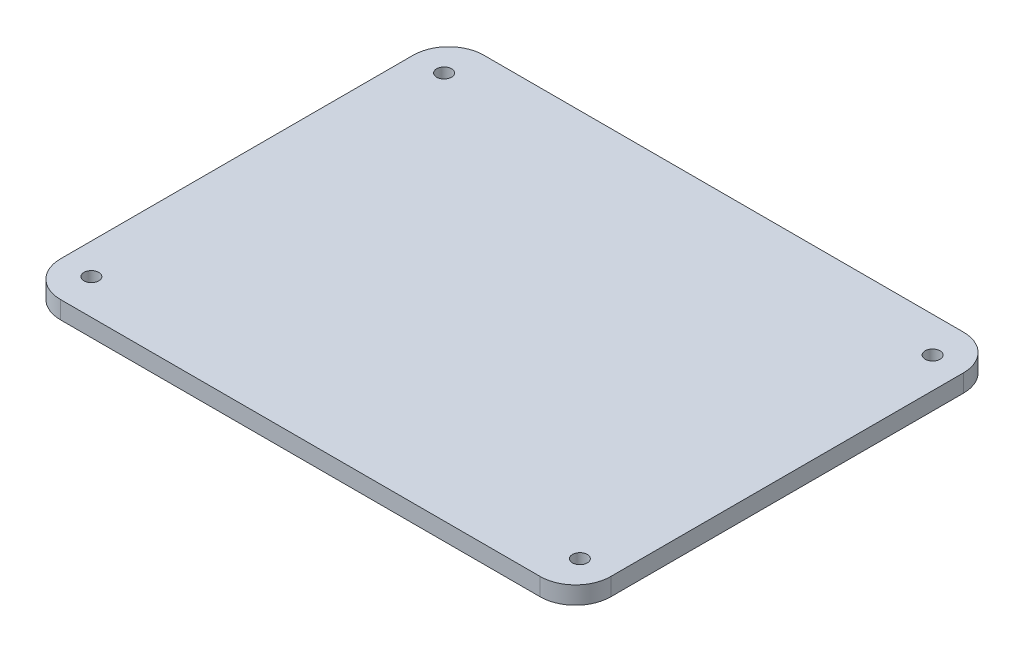
ISO-10303-21;
HEADER;
FILE_DESCRIPTION(('STEP AP214'),'2;1');
FILE_NAME('part.step','',(''),(''),'','','');
FILE_SCHEMA(('AUTOMOTIVE_DESIGN { 1 0 10303 214 1 1 1 1 }'));
ENDSEC;
DATA;
#1=APPLICATION_CONTEXT('core data for automotive mechanical design processes');
#2=APPLICATION_PROTOCOL_DEFINITION('international standard','automotive_design',2000,#1);
#3=PRODUCT_CONTEXT('',#1,'mechanical');
#4=PRODUCT('Part','Part','',(#3));
#5=PRODUCT_RELATED_PRODUCT_CATEGORY('part','',(#4));
#6=PRODUCT_DEFINITION_FORMATION('','',#4);
#7=PRODUCT_DEFINITION_CONTEXT('part definition',#1,'design');
#8=PRODUCT_DEFINITION('design','',#6,#7);
#9=PRODUCT_DEFINITION_SHAPE('','',#8);
#10=(LENGTH_UNIT() NAMED_UNIT(*) SI_UNIT(.MILLI.,.METRE.));
#11=(NAMED_UNIT(*) PLANE_ANGLE_UNIT() SI_UNIT($,.RADIAN.));
#12=(NAMED_UNIT(*) SI_UNIT($,.STERADIAN.) SOLID_ANGLE_UNIT());
#13=UNCERTAINTY_MEASURE_WITH_UNIT(LENGTH_MEASURE(1.E-05),#10,'distance_accuracy_value','');
#14=(GEOMETRIC_REPRESENTATION_CONTEXT(3) GLOBAL_UNCERTAINTY_ASSIGNED_CONTEXT((#13)) GLOBAL_UNIT_ASSIGNED_CONTEXT((#10,
#11,#12)) REPRESENTATION_CONTEXT('',''));
#15=CARTESIAN_POINT('',(0.,0.,0.));
#16=DIRECTION('',(0.,0.,1.));
#17=DIRECTION('',(1.,0.,0.));
#18=AXIS2_PLACEMENT_3D('',#15,#16,#17);
#19=CARTESIAN_POINT('',(78.,5.,60.));
#20=DIRECTION('',(-1.,0.,0.));
#21=DIRECTION('',(0.,0.,1.));
#22=AXIS2_PLACEMENT_3D('',#19,#20,#21);
#23=PLANE('',#22);
#24=DIRECTION('',(0.,0.,-1.));
#25=VECTOR('',#24,1.);
#26=CARTESIAN_POINT('',(78.,5.,60.));
#27=LINE('',#26,#25);
#28=CARTESIAN_POINT('',(78.,5.,50.));
#29=VERTEX_POINT('',#28);
#30=CARTESIAN_POINT('',(78.,5.,-50.));
#31=VERTEX_POINT('',#30);
#32=EDGE_CURVE('E141',#29,#31,#27,.T.);
#33=ORIENTED_EDGE('',*,*,#32,.F.);
#34=DIRECTION('',(0.,-1.,0.));
#35=VECTOR('',#34,1.);
#36=CARTESIAN_POINT('',(78.,5.,50.));
#37=LINE('',#36,#35);
#38=CARTESIAN_POINT('',(78.,0.,50.));
#39=VERTEX_POINT('',#38);
#40=EDGE_CURVE('E180',#29,#39,#37,.T.);
#41=ORIENTED_EDGE('',*,*,#40,.T.);
#42=DIRECTION('',(0.,0.,-1.));
#43=VECTOR('',#42,1.);
#44=CARTESIAN_POINT('',(78.,0.,60.));
#45=LINE('',#44,#43);
#46=CARTESIAN_POINT('',(78.,0.,-50.));
#47=VERTEX_POINT('',#46);
#48=EDGE_CURVE('E195',#39,#47,#45,.T.);
#49=ORIENTED_EDGE('',*,*,#48,.T.);
#50=DIRECTION('',(0.,-1.,0.));
#51=VECTOR('',#50,1.);
#52=CARTESIAN_POINT('',(78.,5.,-50.));
#53=LINE('',#52,#51);
#54=EDGE_CURVE('E177',#47,#31,#53,.F.);
#55=ORIENTED_EDGE('',*,*,#54,.T.);
#56=EDGE_LOOP('',(#33,#41,#49,#55));
#57=FACE_BOUND('',#56,.T.);
#58=ADVANCED_FACE('F45',(#57),#23,.F.);
#59=CARTESIAN_POINT('',(-78.,5.,-60.));
#60=DIRECTION('',(0.,0.,1.));
#61=DIRECTION('',(1.,0.,0.));
#62=AXIS2_PLACEMENT_3D('',#59,#60,#61);
#63=PLANE('',#62);
#64=DIRECTION('',(-1.,0.,0.));
#65=VECTOR('',#64,1.);
#66=CARTESIAN_POINT('',(-78.,5.,-60.));
#67=LINE('',#66,#65);
#68=CARTESIAN_POINT('',(68.,5.,-60.));
#69=VERTEX_POINT('',#68);
#70=CARTESIAN_POINT('',(-68.,5.,-60.));
#71=VERTEX_POINT('',#70);
#72=EDGE_CURVE('E146',#69,#71,#67,.T.);
#73=ORIENTED_EDGE('',*,*,#72,.F.);
#74=DIRECTION('',(0.,-1.,0.));
#75=VECTOR('',#74,1.);
#76=CARTESIAN_POINT('',(68.,5.,-60.));
#77=LINE('',#76,#75);
#78=CARTESIAN_POINT('',(68.,0.,-60.));
#79=VERTEX_POINT('',#78);
#80=EDGE_CURVE('E11',#69,#79,#77,.T.);
#81=ORIENTED_EDGE('',*,*,#80,.T.);
#82=DIRECTION('',(-1.,0.,0.));
#83=VECTOR('',#82,1.);
#84=CARTESIAN_POINT('',(-78.,0.,-60.));
#85=LINE('',#84,#83);
#86=CARTESIAN_POINT('',(-68.,0.,-60.));
#87=VERTEX_POINT('',#86);
#88=EDGE_CURVE('E148',#79,#87,#85,.T.);
#89=ORIENTED_EDGE('',*,*,#88,.T.);
#90=DIRECTION('',(0.,-1.,0.));
#91=VECTOR('',#90,1.);
#92=CARTESIAN_POINT('',(-68.,5.,-60.));
#93=LINE('',#92,#91);
#94=EDGE_CURVE('E54',#87,#71,#93,.F.);
#95=ORIENTED_EDGE('',*,*,#94,.T.);
#96=EDGE_LOOP('',(#73,#81,#89,#95));
#97=FACE_BOUND('',#96,.T.);
#98=ADVANCED_FACE('F201',(#97),#63,.F.);
#99=CARTESIAN_POINT('',(-78.,5.,60.));
#100=DIRECTION('',(1.,0.,0.));
#101=DIRECTION('',(0.,0.,-1.));
#102=AXIS2_PLACEMENT_3D('',#99,#100,#101);
#103=PLANE('',#102);
#104=DIRECTION('',(0.,0.,1.));
#105=VECTOR('',#104,1.);
#106=CARTESIAN_POINT('',(-78.,0.,60.));
#107=LINE('',#106,#105);
#108=CARTESIAN_POINT('',(-78.,0.,-50.));
#109=VERTEX_POINT('',#108);
#110=CARTESIAN_POINT('',(-78.,0.,50.));
#111=VERTEX_POINT('',#110);
#112=EDGE_CURVE('E142',#109,#111,#107,.T.);
#113=ORIENTED_EDGE('',*,*,#112,.T.);
#114=DIRECTION('',(0.,-1.,0.));
#115=VECTOR('',#114,1.);
#116=CARTESIAN_POINT('',(-78.,5.,50.));
#117=LINE('',#116,#115);
#118=CARTESIAN_POINT('',(-78.,5.,50.));
#119=VERTEX_POINT('',#118);
#120=EDGE_CURVE('E117',#111,#119,#117,.F.);
#121=ORIENTED_EDGE('',*,*,#120,.T.);
#122=DIRECTION('',(0.,0.,1.));
#123=VECTOR('',#122,1.);
#124=CARTESIAN_POINT('',(-78.,5.,60.));
#125=LINE('',#124,#123);
#126=CARTESIAN_POINT('',(-78.,5.,-50.));
#127=VERTEX_POINT('',#126);
#128=EDGE_CURVE('E186',#127,#119,#125,.T.);
#129=ORIENTED_EDGE('',*,*,#128,.F.);
#130=DIRECTION('',(0.,-1.,0.));
#131=VECTOR('',#130,1.);
#132=CARTESIAN_POINT('',(-78.,5.,-50.));
#133=LINE('',#132,#131);
#134=EDGE_CURVE('E123',#127,#109,#133,.T.);
#135=ORIENTED_EDGE('',*,*,#134,.T.);
#136=EDGE_LOOP('',(#113,#121,#129,#135));
#137=FACE_BOUND('',#136,.T.);
#138=ADVANCED_FACE('F208',(#137),#103,.F.);
#139=CARTESIAN_POINT('',(-78.,5.,60.));
#140=DIRECTION('',(0.,0.,-1.));
#141=DIRECTION('',(-1.,0.,0.));
#142=AXIS2_PLACEMENT_3D('',#139,#140,#141);
#143=PLANE('',#142);
#144=DIRECTION('',(1.,0.,0.));
#145=VECTOR('',#144,1.);
#146=CARTESIAN_POINT('',(-78.,5.,60.));
#147=LINE('',#146,#145);
#148=CARTESIAN_POINT('',(-68.,5.,60.));
#149=VERTEX_POINT('',#148);
#150=CARTESIAN_POINT('',(68.,5.,60.));
#151=VERTEX_POINT('',#150);
#152=EDGE_CURVE('E133',#149,#151,#147,.T.);
#153=ORIENTED_EDGE('',*,*,#152,.F.);
#154=DIRECTION('',(0.,-1.,0.));
#155=VECTOR('',#154,1.);
#156=CARTESIAN_POINT('',(-68.,5.,60.));
#157=LINE('',#156,#155);
#158=CARTESIAN_POINT('',(-68.,0.,60.));
#159=VERTEX_POINT('',#158);
#160=EDGE_CURVE('E116',#149,#159,#157,.T.);
#161=ORIENTED_EDGE('',*,*,#160,.T.);
#162=DIRECTION('',(1.,0.,0.));
#163=VECTOR('',#162,1.);
#164=CARTESIAN_POINT('',(-78.,0.,60.));
#165=LINE('',#164,#163);
#166=CARTESIAN_POINT('',(68.,0.,60.));
#167=VERTEX_POINT('',#166);
#168=EDGE_CURVE('E130',#159,#167,#165,.T.);
#169=ORIENTED_EDGE('',*,*,#168,.T.);
#170=DIRECTION('',(0.,-1.,0.));
#171=VECTOR('',#170,1.);
#172=CARTESIAN_POINT('',(68.,5.,60.));
#173=LINE('',#172,#171);
#174=EDGE_CURVE('E136',#167,#151,#173,.F.);
#175=ORIENTED_EDGE('',*,*,#174,.T.);
#176=EDGE_LOOP('',(#153,#161,#169,#175));
#177=FACE_BOUND('',#176,.T.);
#178=ADVANCED_FACE('F129',(#177),#143,.F.);
#179=CARTESIAN_POINT('',(0.,5.,0.));
#180=DIRECTION('',(0.,-1.,0.));
#181=DIRECTION('',(0.,0.,-1.));
#182=AXIS2_PLACEMENT_3D('',#179,#180,#181);
#183=PLANE('',#182);
#184=CARTESIAN_POINT('',(69.25,5.,-50.));
#185=DIRECTION('',(0.,1.,0.));
#186=DIRECTION('',(0.,0.,1.));
#187=AXIS2_PLACEMENT_3D('',#184,#185,#186);
#188=CIRCLE('',#187,2.1);
#189=CARTESIAN_POINT('',(69.25,5.,-47.9));
#190=VERTEX_POINT('',#189);
#191=EDGE_CURVE('E341',#190,#190,#188,.T.);
#192=ORIENTED_EDGE('',*,*,#191,.F.);
#193=EDGE_LOOP('',(#192));
#194=FACE_BOUND('',#193,.T.);
#195=CARTESIAN_POINT('',(69.25,5.,50.));
#196=DIRECTION('',(0.,1.,0.));
#197=DIRECTION('',(0.,0.,1.));
#198=AXIS2_PLACEMENT_3D('',#195,#196,#197);
#199=CIRCLE('',#198,2.1);
#200=CARTESIAN_POINT('',(69.25,5.,52.1));
#201=VERTEX_POINT('',#200);
#202=EDGE_CURVE('E345',#201,#201,#199,.T.);
#203=ORIENTED_EDGE('',*,*,#202,.F.);
#204=EDGE_LOOP('',(#203));
#205=FACE_BOUND('',#204,.T.);
#206=CARTESIAN_POINT('',(-69.25,5.,50.));
#207=DIRECTION('',(0.,1.,0.));
#208=DIRECTION('',(0.,0.,1.));
#209=AXIS2_PLACEMENT_3D('',#206,#207,#208);
#210=CIRCLE('',#209,2.1);
#211=CARTESIAN_POINT('',(-69.25,5.,52.1));
#212=VERTEX_POINT('',#211);
#213=EDGE_CURVE('E349',#212,#212,#210,.T.);
#214=ORIENTED_EDGE('',*,*,#213,.F.);
#215=EDGE_LOOP('',(#214));
#216=FACE_BOUND('',#215,.T.);
#217=CARTESIAN_POINT('',(-69.25,5.,-50.));
#218=DIRECTION('',(0.,1.,0.));
#219=DIRECTION('',(0.,0.,1.));
#220=AXIS2_PLACEMENT_3D('',#217,#218,#219);
#221=CIRCLE('',#220,2.1);
#222=CARTESIAN_POINT('',(-69.25,5.,-47.9));
#223=VERTEX_POINT('',#222);
#224=EDGE_CURVE('E352',#223,#223,#221,.T.);
#225=ORIENTED_EDGE('',*,*,#224,.F.);
#226=EDGE_LOOP('',(#225));
#227=FACE_BOUND('',#226,.T.);
#228=ORIENTED_EDGE('',*,*,#128,.T.);
#229=CARTESIAN_POINT('',(-68.,5.,50.));
#230=DIRECTION('',(0.,-1.,0.));
#231=DIRECTION('',(0.,0.,-1.));
#232=AXIS2_PLACEMENT_3D('',#229,#230,#231);
#233=CIRCLE('',#232,10.);
#234=EDGE_CURVE('E174',#119,#149,#233,.F.);
#235=ORIENTED_EDGE('',*,*,#234,.T.);
#236=ORIENTED_EDGE('',*,*,#152,.T.);
#237=CARTESIAN_POINT('',(68.,5.,50.));
#238=DIRECTION('',(0.,-1.,0.));
#239=DIRECTION('',(0.,0.,-1.));
#240=AXIS2_PLACEMENT_3D('',#237,#238,#239);
#241=CIRCLE('',#240,10.);
#242=EDGE_CURVE('E171',#151,#29,#241,.F.);
#243=ORIENTED_EDGE('',*,*,#242,.T.);
#244=ORIENTED_EDGE('',*,*,#32,.T.);
#245=CARTESIAN_POINT('',(68.,5.,-50.));
#246=DIRECTION('',(0.,-1.,0.));
#247=DIRECTION('',(0.,0.,-1.));
#248=AXIS2_PLACEMENT_3D('',#245,#246,#247);
#249=CIRCLE('',#248,10.);
#250=EDGE_CURVE('E67',#31,#69,#249,.F.);
#251=ORIENTED_EDGE('',*,*,#250,.T.);
#252=ORIENTED_EDGE('',*,*,#72,.T.);
#253=CARTESIAN_POINT('',(-68.,5.,-50.));
#254=DIRECTION('',(0.,-1.,0.));
#255=DIRECTION('',(0.,0.,-1.));
#256=AXIS2_PLACEMENT_3D('',#253,#254,#255);
#257=CIRCLE('',#256,10.);
#258=EDGE_CURVE('E166',#71,#127,#257,.F.);
#259=ORIENTED_EDGE('',*,*,#258,.T.);
#260=EDGE_LOOP('',(#228,#235,#236,#243,#244,#251,#252,#259));
#261=FACE_BOUND('',#260,.T.);
#262=ADVANCED_FACE('F206',(#194,#205,#216,#227,#261),#183,.F.);
#263=CARTESIAN_POINT('',(0.,0.,0.));
#264=DIRECTION('',(0.,-1.,0.));
#265=DIRECTION('',(0.,0.,-1.));
#266=AXIS2_PLACEMENT_3D('',#263,#264,#265);
#267=PLANE('',#266);
#268=CARTESIAN_POINT('',(69.25,0.,-50.));
#269=DIRECTION('',(0.,1.,0.));
#270=DIRECTION('',(0.,0.,1.));
#271=AXIS2_PLACEMENT_3D('',#268,#269,#270);
#272=CIRCLE('',#271,2.1);
#273=CARTESIAN_POINT('',(69.25,0.,-47.9));
#274=VERTEX_POINT('',#273);
#275=EDGE_CURVE('E362',#274,#274,#272,.T.);
#276=ORIENTED_EDGE('',*,*,#275,.T.);
#277=EDGE_LOOP('',(#276));
#278=FACE_BOUND('',#277,.T.);
#279=CARTESIAN_POINT('',(69.25,0.,50.));
#280=DIRECTION('',(0.,1.,0.));
#281=DIRECTION('',(0.,0.,1.));
#282=AXIS2_PLACEMENT_3D('',#279,#280,#281);
#283=CIRCLE('',#282,2.1);
#284=CARTESIAN_POINT('',(69.25,0.,52.1));
#285=VERTEX_POINT('',#284);
#286=EDGE_CURVE('E368',#285,#285,#283,.T.);
#287=ORIENTED_EDGE('',*,*,#286,.T.);
#288=EDGE_LOOP('',(#287));
#289=FACE_BOUND('',#288,.T.);
#290=CARTESIAN_POINT('',(-69.25,0.,50.));
#291=DIRECTION('',(0.,1.,0.));
#292=DIRECTION('',(0.,0.,1.));
#293=AXIS2_PLACEMENT_3D('',#290,#291,#292);
#294=CIRCLE('',#293,2.1);
#295=CARTESIAN_POINT('',(-69.25,0.,52.1));
#296=VERTEX_POINT('',#295);
#297=EDGE_CURVE('E359',#296,#296,#294,.T.);
#298=ORIENTED_EDGE('',*,*,#297,.T.);
#299=EDGE_LOOP('',(#298));
#300=FACE_BOUND('',#299,.T.);
#301=CARTESIAN_POINT('',(-69.25,0.,-50.));
#302=DIRECTION('',(0.,1.,0.));
#303=DIRECTION('',(0.,0.,1.));
#304=AXIS2_PLACEMENT_3D('',#301,#302,#303);
#305=CIRCLE('',#304,2.1);
#306=CARTESIAN_POINT('',(-69.25,0.,-47.9));
#307=VERTEX_POINT('',#306);
#308=EDGE_CURVE('E198',#307,#307,#305,.T.);
#309=ORIENTED_EDGE('',*,*,#308,.T.);
#310=EDGE_LOOP('',(#309));
#311=FACE_BOUND('',#310,.T.);
#312=ORIENTED_EDGE('',*,*,#168,.F.);
#313=CARTESIAN_POINT('',(-68.,0.,50.));
#314=DIRECTION('',(0.,-1.,0.));
#315=DIRECTION('',(0.,0.,-1.));
#316=AXIS2_PLACEMENT_3D('',#313,#314,#315);
#317=CIRCLE('',#316,10.);
#318=EDGE_CURVE('E112',#159,#111,#317,.T.);
#319=ORIENTED_EDGE('',*,*,#318,.T.);
#320=ORIENTED_EDGE('',*,*,#112,.F.);
#321=CARTESIAN_POINT('',(-68.,0.,-50.));
#322=DIRECTION('',(0.,-1.,0.));
#323=DIRECTION('',(0.,0.,-1.));
#324=AXIS2_PLACEMENT_3D('',#321,#322,#323);
#325=CIRCLE('',#324,10.);
#326=EDGE_CURVE('E135',#109,#87,#325,.T.);
#327=ORIENTED_EDGE('',*,*,#326,.T.);
#328=ORIENTED_EDGE('',*,*,#88,.F.);
#329=CARTESIAN_POINT('',(68.,0.,-50.));
#330=DIRECTION('',(0.,-1.,0.));
#331=DIRECTION('',(0.,0.,-1.));
#332=AXIS2_PLACEMENT_3D('',#329,#330,#331);
#333=CIRCLE('',#332,10.);
#334=EDGE_CURVE('E156',#79,#47,#333,.T.);
#335=ORIENTED_EDGE('',*,*,#334,.T.);
#336=ORIENTED_EDGE('',*,*,#48,.F.);
#337=CARTESIAN_POINT('',(68.,0.,50.));
#338=DIRECTION('',(0.,-1.,0.));
#339=DIRECTION('',(0.,0.,-1.));
#340=AXIS2_PLACEMENT_3D('',#337,#338,#339);
#341=CIRCLE('',#340,10.);
#342=EDGE_CURVE('E124',#39,#167,#341,.T.);
#343=ORIENTED_EDGE('',*,*,#342,.T.);
#344=EDGE_LOOP('',(#312,#319,#320,#327,#328,#335,#336,#343));
#345=FACE_BOUND('',#344,.T.);
#346=ADVANCED_FACE('F138',(#278,#289,#300,#311,#345),#267,.T.);
#347=CARTESIAN_POINT('',(-69.25,0.,-50.));
#348=DIRECTION('',(0.,1.,0.));
#349=DIRECTION('',(0.,0.,1.));
#350=AXIS2_PLACEMENT_3D('',#347,#348,#349);
#351=CYLINDRICAL_SURFACE('',#350,2.1);
#352=ORIENTED_EDGE('',*,*,#308,.F.);
#353=EDGE_LOOP('',(#352));
#354=FACE_BOUND('',#353,.T.);
#355=ORIENTED_EDGE('',*,*,#224,.T.);
#356=EDGE_LOOP('',(#355));
#357=FACE_BOUND('',#356,.T.);
#358=ADVANCED_FACE('F288',(#354,#357),#351,.F.);
#359=CARTESIAN_POINT('',(-69.25,0.,50.));
#360=DIRECTION('',(0.,1.,0.));
#361=DIRECTION('',(0.,0.,1.));
#362=AXIS2_PLACEMENT_3D('',#359,#360,#361);
#363=CYLINDRICAL_SURFACE('',#362,2.1);
#364=ORIENTED_EDGE('',*,*,#297,.F.);
#365=EDGE_LOOP('',(#364));
#366=FACE_BOUND('',#365,.T.);
#367=ORIENTED_EDGE('',*,*,#213,.T.);
#368=EDGE_LOOP('',(#367));
#369=FACE_BOUND('',#368,.T.);
#370=ADVANCED_FACE('F278',(#366,#369),#363,.F.);
#371=CARTESIAN_POINT('',(69.25,0.,50.));
#372=DIRECTION('',(0.,1.,0.));
#373=DIRECTION('',(0.,0.,1.));
#374=AXIS2_PLACEMENT_3D('',#371,#372,#373);
#375=CYLINDRICAL_SURFACE('',#374,2.1);
#376=ORIENTED_EDGE('',*,*,#286,.F.);
#377=EDGE_LOOP('',(#376));
#378=FACE_BOUND('',#377,.T.);
#379=ORIENTED_EDGE('',*,*,#202,.T.);
#380=EDGE_LOOP('',(#379));
#381=FACE_BOUND('',#380,.T.);
#382=ADVANCED_FACE('F268',(#378,#381),#375,.F.);
#383=CARTESIAN_POINT('',(69.25,0.,-50.));
#384=DIRECTION('',(0.,1.,0.));
#385=DIRECTION('',(0.,0.,1.));
#386=AXIS2_PLACEMENT_3D('',#383,#384,#385);
#387=CYLINDRICAL_SURFACE('',#386,2.1);
#388=ORIENTED_EDGE('',*,*,#275,.F.);
#389=EDGE_LOOP('',(#388));
#390=FACE_BOUND('',#389,.T.);
#391=ORIENTED_EDGE('',*,*,#191,.T.);
#392=EDGE_LOOP('',(#391));
#393=FACE_BOUND('',#392,.T.);
#394=ADVANCED_FACE('F228',(#390,#393),#387,.F.);
#395=CARTESIAN_POINT('',(-68.,5.,50.));
#396=DIRECTION('',(0.,-1.,0.));
#397=DIRECTION('',(0.,0.,-1.));
#398=AXIS2_PLACEMENT_3D('',#395,#396,#397);
#399=CYLINDRICAL_SURFACE('',#398,10.);
#400=ORIENTED_EDGE('',*,*,#234,.F.);
#401=ORIENTED_EDGE('',*,*,#120,.F.);
#402=ORIENTED_EDGE('',*,*,#318,.F.);
#403=ORIENTED_EDGE('',*,*,#160,.F.);
#404=EDGE_LOOP('',(#400,#401,#402,#403));
#405=FACE_BOUND('',#404,.T.);
#406=ADVANCED_FACE('F115',(#405),#399,.T.);
#407=CARTESIAN_POINT('',(68.,5.,50.));
#408=DIRECTION('',(0.,-1.,0.));
#409=DIRECTION('',(0.,0.,-1.));
#410=AXIS2_PLACEMENT_3D('',#407,#408,#409);
#411=CYLINDRICAL_SURFACE('',#410,10.);
#412=ORIENTED_EDGE('',*,*,#242,.F.);
#413=ORIENTED_EDGE('',*,*,#174,.F.);
#414=ORIENTED_EDGE('',*,*,#342,.F.);
#415=ORIENTED_EDGE('',*,*,#40,.F.);
#416=EDGE_LOOP('',(#412,#413,#414,#415));
#417=FACE_BOUND('',#416,.T.);
#418=ADVANCED_FACE('F227',(#417),#411,.T.);
#419=CARTESIAN_POINT('',(68.,5.,-50.));
#420=DIRECTION('',(0.,-1.,0.));
#421=DIRECTION('',(0.,0.,-1.));
#422=AXIS2_PLACEMENT_3D('',#419,#420,#421);
#423=CYLINDRICAL_SURFACE('',#422,10.);
#424=ORIENTED_EDGE('',*,*,#250,.F.);
#425=ORIENTED_EDGE('',*,*,#54,.F.);
#426=ORIENTED_EDGE('',*,*,#334,.F.);
#427=ORIENTED_EDGE('',*,*,#80,.F.);
#428=EDGE_LOOP('',(#424,#425,#426,#427));
#429=FACE_BOUND('',#428,.T.);
#430=ADVANCED_FACE('F230',(#429),#423,.T.);
#431=CARTESIAN_POINT('',(-68.,5.,-50.));
#432=DIRECTION('',(0.,-1.,0.));
#433=DIRECTION('',(0.,0.,-1.));
#434=AXIS2_PLACEMENT_3D('',#431,#432,#433);
#435=CYLINDRICAL_SURFACE('',#434,10.);
#436=ORIENTED_EDGE('',*,*,#258,.F.);
#437=ORIENTED_EDGE('',*,*,#94,.F.);
#438=ORIENTED_EDGE('',*,*,#326,.F.);
#439=ORIENTED_EDGE('',*,*,#134,.F.);
#440=EDGE_LOOP('',(#436,#437,#438,#439));
#441=FACE_BOUND('',#440,.T.);
#442=ADVANCED_FACE('F47',(#441),#435,.T.);
#443=CLOSED_SHELL('',(#58,#98,#138,#178,#262,#346,#358,#370,#382,#394,#406,#418,#430,#442));
#444=MANIFOLD_SOLID_BREP('B2',#443);
#445=ADVANCED_BREP_SHAPE_REPRESENTATION('',(#18,#444),#14);
#446=SHAPE_DEFINITION_REPRESENTATION(#9,#445);
ENDSEC;
END-ISO-10303-21;
